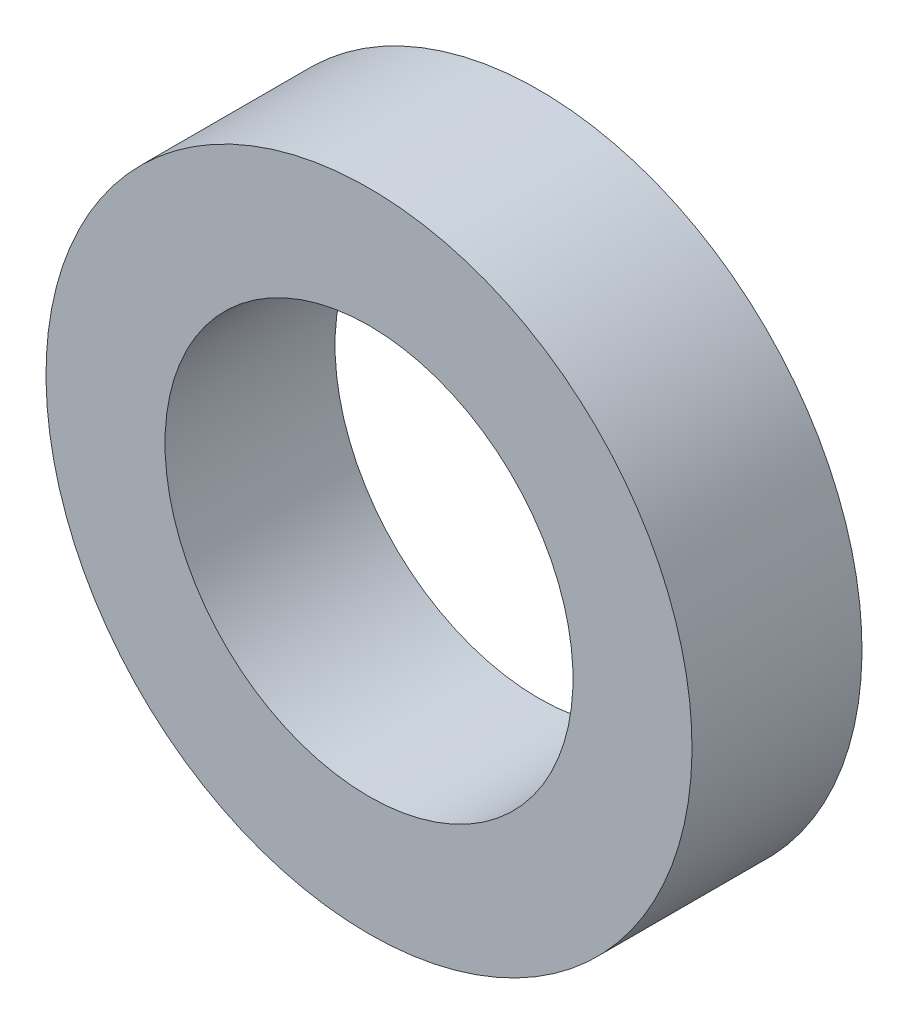
ISO-10303-21;
HEADER;
FILE_DESCRIPTION(('STEP AP214'),'2;1');
FILE_NAME('part.step','',(''),(''),'','','');
FILE_SCHEMA(('AUTOMOTIVE_DESIGN { 1 0 10303 214 1 1 1 1 }'));
ENDSEC;
DATA;
#1=APPLICATION_CONTEXT('core data for automotive mechanical design processes');
#2=APPLICATION_PROTOCOL_DEFINITION('international standard','automotive_design',2000,#1);
#3=PRODUCT_CONTEXT('',#1,'mechanical');
#4=PRODUCT('Part','Part','',(#3));
#5=PRODUCT_RELATED_PRODUCT_CATEGORY('part','',(#4));
#6=PRODUCT_DEFINITION_FORMATION('','',#4);
#7=PRODUCT_DEFINITION_CONTEXT('part definition',#1,'design');
#8=PRODUCT_DEFINITION('design','',#6,#7);
#9=PRODUCT_DEFINITION_SHAPE('','',#8);
#10=(LENGTH_UNIT() NAMED_UNIT(*) SI_UNIT(.MILLI.,.METRE.));
#11=(NAMED_UNIT(*) PLANE_ANGLE_UNIT() SI_UNIT($,.RADIAN.));
#12=(NAMED_UNIT(*) SI_UNIT($,.STERADIAN.) SOLID_ANGLE_UNIT());
#13=UNCERTAINTY_MEASURE_WITH_UNIT(LENGTH_MEASURE(1.E-05),#10,'distance_accuracy_value','');
#14=(GEOMETRIC_REPRESENTATION_CONTEXT(3) GLOBAL_UNCERTAINTY_ASSIGNED_CONTEXT((#13)) GLOBAL_UNIT_ASSIGNED_CONTEXT((#10,
#11,#12)) REPRESENTATION_CONTEXT('',''));
#15=CARTESIAN_POINT('',(0.,0.,0.));
#16=DIRECTION('',(0.,0.,1.));
#17=DIRECTION('',(1.,0.,0.));
#18=AXIS2_PLACEMENT_3D('',#15,#16,#17);
#19=CARTESIAN_POINT('',(0.,0.,-5.));
#20=DIRECTION('',(0.,0.,1.));
#21=DIRECTION('',(0.,-1.,0.));
#22=AXIS2_PLACEMENT_3D('',#19,#20,#21);
#23=CYLINDRICAL_SURFACE('',#22,9.5);
#24=CARTESIAN_POINT('',(0.,0.,-5.));
#25=DIRECTION('',(0.,0.,1.));
#26=DIRECTION('',(0.,-1.,0.));
#27=AXIS2_PLACEMENT_3D('',#24,#25,#26);
#28=CIRCLE('',#27,9.5);
#29=CARTESIAN_POINT('',(0.,-9.5,-5.));
#30=VERTEX_POINT('',#29);
#31=EDGE_CURVE('E19',#30,#30,#28,.T.);
#32=ORIENTED_EDGE('',*,*,#31,.T.);
#33=EDGE_LOOP('',(#32));
#34=FACE_BOUND('',#33,.T.);
#35=CARTESIAN_POINT('',(0.,0.,0.));
#36=DIRECTION('',(0.,0.,1.));
#37=DIRECTION('',(0.,-1.,0.));
#38=AXIS2_PLACEMENT_3D('',#35,#36,#37);
#39=CIRCLE('',#38,9.5);
#40=CARTESIAN_POINT('',(0.,-9.5,0.));
#41=VERTEX_POINT('',#40);
#42=EDGE_CURVE('E28',#41,#41,#39,.T.);
#43=ORIENTED_EDGE('',*,*,#42,.F.);
#44=EDGE_LOOP('',(#43));
#45=FACE_BOUND('',#44,.T.);
#46=ADVANCED_FACE('F15',(#34,#45),#23,.T.);
#47=CARTESIAN_POINT('',(-9.614,-9.614,-5.));
#48=DIRECTION('',(0.,0.,1.));
#49=DIRECTION('',(1.,0.,0.));
#50=AXIS2_PLACEMENT_3D('',#47,#48,#49);
#51=PLANE('',#50);
#52=CARTESIAN_POINT('',(0.,0.,-5.));
#53=DIRECTION('',(0.,0.,1.));
#54=DIRECTION('',(0.,-1.,0.));
#55=AXIS2_PLACEMENT_3D('',#52,#53,#54);
#56=CIRCLE('',#55,6.);
#57=CARTESIAN_POINT('',(0.,-6.,-5.));
#58=VERTEX_POINT('',#57);
#59=EDGE_CURVE('E23',#58,#58,#56,.F.);
#60=ORIENTED_EDGE('',*,*,#59,.F.);
#61=EDGE_LOOP('',(#60));
#62=FACE_BOUND('',#61,.T.);
#63=ORIENTED_EDGE('',*,*,#31,.F.);
#64=EDGE_LOOP('',(#63));
#65=FACE_BOUND('',#64,.T.);
#66=ADVANCED_FACE('F38',(#62,#65),#51,.F.);
#67=CARTESIAN_POINT('',(-9.614,-9.614,0.));
#68=DIRECTION('',(0.,0.,1.));
#69=DIRECTION('',(1.,0.,0.));
#70=AXIS2_PLACEMENT_3D('',#67,#68,#69);
#71=PLANE('',#70);
#72=CARTESIAN_POINT('',(0.,0.,0.));
#73=DIRECTION('',(0.,0.,1.));
#74=DIRECTION('',(0.,-1.,0.));
#75=AXIS2_PLACEMENT_3D('',#72,#73,#74);
#76=CIRCLE('',#75,6.);
#77=CARTESIAN_POINT('',(0.,-6.,0.));
#78=VERTEX_POINT('',#77);
#79=EDGE_CURVE('E10',#78,#78,#76,.T.);
#80=ORIENTED_EDGE('',*,*,#79,.F.);
#81=EDGE_LOOP('',(#80));
#82=FACE_BOUND('',#81,.T.);
#83=ORIENTED_EDGE('',*,*,#42,.T.);
#84=EDGE_LOOP('',(#83));
#85=FACE_BOUND('',#84,.T.);
#86=ADVANCED_FACE('F17',(#82,#85),#71,.T.);
#87=CARTESIAN_POINT('',(0.,0.,-5.));
#88=DIRECTION('',(0.,0.,1.));
#89=DIRECTION('',(0.,-1.,0.));
#90=AXIS2_PLACEMENT_3D('',#87,#88,#89);
#91=CYLINDRICAL_SURFACE('',#90,6.);
#92=ORIENTED_EDGE('',*,*,#79,.T.);
#93=EDGE_LOOP('',(#92));
#94=FACE_BOUND('',#93,.T.);
#95=ORIENTED_EDGE('',*,*,#59,.T.);
#96=EDGE_LOOP('',(#95));
#97=FACE_BOUND('',#96,.T.);
#98=ADVANCED_FACE('F46',(#94,#97),#91,.F.);
#99=CLOSED_SHELL('',(#46,#66,#86,#98));
#100=MANIFOLD_SOLID_BREP('B1',#99);
#101=ADVANCED_BREP_SHAPE_REPRESENTATION('',(#18,#100),#14);
#102=SHAPE_DEFINITION_REPRESENTATION(#9,#101);
ENDSEC;
END-ISO-10303-21;
